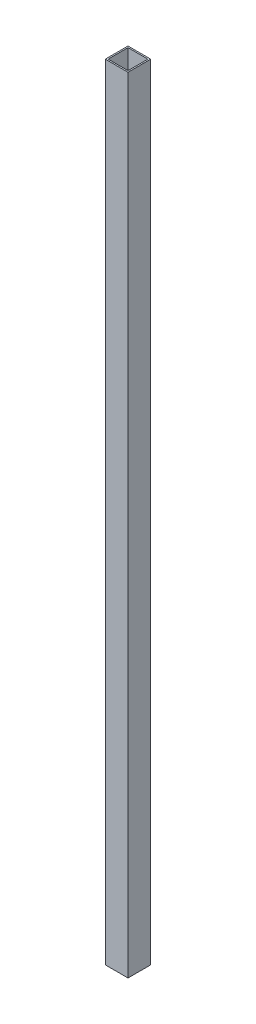
ISO-10303-21;
HEADER;
FILE_DESCRIPTION(('STEP AP214'),'2;1');
FILE_NAME('part.step','',(''),(''),'','','');
FILE_SCHEMA(('AUTOMOTIVE_DESIGN { 1 0 10303 214 1 1 1 1 }'));
ENDSEC;
DATA;
#1=APPLICATION_CONTEXT('core data for automotive mechanical design processes');
#2=APPLICATION_PROTOCOL_DEFINITION('international standard','automotive_design',2000,#1);
#3=PRODUCT_CONTEXT('',#1,'mechanical');
#4=PRODUCT('Part','Part','',(#3));
#5=PRODUCT_RELATED_PRODUCT_CATEGORY('part','',(#4));
#6=PRODUCT_DEFINITION_FORMATION('','',#4);
#7=PRODUCT_DEFINITION_CONTEXT('part definition',#1,'design');
#8=PRODUCT_DEFINITION('design','',#6,#7);
#9=PRODUCT_DEFINITION_SHAPE('','',#8);
#10=(LENGTH_UNIT() NAMED_UNIT(*) SI_UNIT(.MILLI.,.METRE.));
#11=(NAMED_UNIT(*) PLANE_ANGLE_UNIT() SI_UNIT($,.RADIAN.));
#12=(NAMED_UNIT(*) SI_UNIT($,.STERADIAN.) SOLID_ANGLE_UNIT());
#13=UNCERTAINTY_MEASURE_WITH_UNIT(LENGTH_MEASURE(1.E-05),#10,'distance_accuracy_value','');
#14=(GEOMETRIC_REPRESENTATION_CONTEXT(3) GLOBAL_UNCERTAINTY_ASSIGNED_CONTEXT((#13)) GLOBAL_UNIT_ASSIGNED_CONTEXT((#10,
#11,#12)) REPRESENTATION_CONTEXT('',''));
#15=CARTESIAN_POINT('',(0.,0.,0.));
#16=DIRECTION('',(0.,0.,1.));
#17=DIRECTION('',(1.,0.,0.));
#18=AXIS2_PLACEMENT_3D('',#15,#16,#17);
#19=CARTESIAN_POINT('',(-12.7,0.,12.7));
#20=DIRECTION('',(0.,-1.,0.));
#21=DIRECTION('',(0.,0.,-1.));
#22=AXIS2_PLACEMENT_3D('',#19,#20,#21);
#23=PLANE('',#22);
#24=DIRECTION('',(-1.,0.,0.));
#25=VECTOR('',#24,1.);
#26=CARTESIAN_POINT('',(0.,0.,11.1125));
#27=LINE('',#26,#25);
#28=CARTESIAN_POINT('',(11.1125,0.,11.1125));
#29=VERTEX_POINT('',#28);
#30=CARTESIAN_POINT('',(-11.1125,0.,11.1125));
#31=VERTEX_POINT('',#30);
#32=EDGE_CURVE('E108',#29,#31,#27,.T.);
#33=ORIENTED_EDGE('',*,*,#32,.F.);
#34=DIRECTION('',(0.,0.,1.));
#35=VECTOR('',#34,1.);
#36=CARTESIAN_POINT('',(11.1125,0.,0.));
#37=LINE('',#36,#35);
#38=CARTESIAN_POINT('',(11.1125,0.,-11.1125));
#39=VERTEX_POINT('',#38);
#40=EDGE_CURVE('E110',#39,#29,#37,.T.);
#41=ORIENTED_EDGE('',*,*,#40,.F.);
#42=DIRECTION('',(1.,0.,0.));
#43=VECTOR('',#42,1.);
#44=CARTESIAN_POINT('',(0.,0.,-11.1125));
#45=LINE('',#44,#43);
#46=CARTESIAN_POINT('',(-11.1125,0.,-11.1125));
#47=VERTEX_POINT('',#46);
#48=EDGE_CURVE('E114',#47,#39,#45,.T.);
#49=ORIENTED_EDGE('',*,*,#48,.F.);
#50=DIRECTION('',(0.,0.,-1.));
#51=VECTOR('',#50,1.);
#52=CARTESIAN_POINT('',(-11.1125,0.,0.));
#53=LINE('',#52,#51);
#54=EDGE_CURVE('E118',#31,#47,#53,.T.);
#55=ORIENTED_EDGE('',*,*,#54,.F.);
#56=EDGE_LOOP('',(#33,#41,#49,#55));
#57=FACE_BOUND('',#56,.T.);
#58=DIRECTION('',(0.,0.,1.));
#59=VECTOR('',#58,1.);
#60=CARTESIAN_POINT('',(12.7,0.,0.));
#61=LINE('',#60,#59);
#62=CARTESIAN_POINT('',(12.7,0.,-12.7));
#63=VERTEX_POINT('',#62);
#64=CARTESIAN_POINT('',(12.7,0.,12.7));
#65=VERTEX_POINT('',#64);
#66=EDGE_CURVE('E78',#63,#65,#61,.T.);
#67=ORIENTED_EDGE('',*,*,#66,.T.);
#68=DIRECTION('',(-1.,0.,0.));
#69=VECTOR('',#68,1.);
#70=CARTESIAN_POINT('',(0.,0.,12.7));
#71=LINE('',#70,#69);
#72=CARTESIAN_POINT('',(-12.7,0.,12.7));
#73=VERTEX_POINT('',#72);
#74=EDGE_CURVE('E100',#65,#73,#71,.T.);
#75=ORIENTED_EDGE('',*,*,#74,.T.);
#76=DIRECTION('',(0.,0.,-1.));
#77=VECTOR('',#76,1.);
#78=CARTESIAN_POINT('',(-12.7,0.,0.));
#79=LINE('',#78,#77);
#80=CARTESIAN_POINT('',(-12.7,0.,-12.7));
#81=VERTEX_POINT('',#80);
#82=EDGE_CURVE('E82',#73,#81,#79,.T.);
#83=ORIENTED_EDGE('',*,*,#82,.T.);
#84=DIRECTION('',(1.,0.,0.));
#85=VECTOR('',#84,1.);
#86=CARTESIAN_POINT('',(0.,0.,-12.7));
#87=LINE('',#86,#85);
#88=EDGE_CURVE('E20',#81,#63,#87,.T.);
#89=ORIENTED_EDGE('',*,*,#88,.T.);
#90=EDGE_LOOP('',(#67,#75,#83,#89));
#91=FACE_BOUND('',#90,.T.);
#92=ADVANCED_FACE('F16',(#57,#91),#23,.T.);
#93=CARTESIAN_POINT('',(-12.7,0.,-12.7));
#94=DIRECTION('',(0.,0.,1.));
#95=DIRECTION('',(1.,0.,0.));
#96=AXIS2_PLACEMENT_3D('',#93,#94,#95);
#97=PLANE('',#96);
#98=DIRECTION('',(0.,1.,0.));
#99=VECTOR('',#98,1.);
#100=CARTESIAN_POINT('',(-12.7,438.15,-12.7));
#101=LINE('',#100,#99);
#102=CARTESIAN_POINT('',(-12.7,876.3,-12.7));
#103=VERTEX_POINT('',#102);
#104=EDGE_CURVE('E102',#81,#103,#101,.T.);
#105=ORIENTED_EDGE('',*,*,#104,.T.);
#106=DIRECTION('',(1.,0.,0.));
#107=VECTOR('',#106,1.);
#108=CARTESIAN_POINT('',(0.,876.3,-12.7));
#109=LINE('',#108,#107);
#110=CARTESIAN_POINT('',(12.7,876.3,-12.7));
#111=VERTEX_POINT('',#110);
#112=EDGE_CURVE('E97',#103,#111,#109,.T.);
#113=ORIENTED_EDGE('',*,*,#112,.T.);
#114=DIRECTION('',(0.,-1.,0.));
#115=VECTOR('',#114,1.);
#116=CARTESIAN_POINT('',(12.7,438.15,-12.7));
#117=LINE('',#116,#115);
#118=EDGE_CURVE('E87',#111,#63,#117,.T.);
#119=ORIENTED_EDGE('',*,*,#118,.T.);
#120=ORIENTED_EDGE('',*,*,#88,.F.);
#121=EDGE_LOOP('',(#105,#113,#119,#120));
#122=FACE_BOUND('',#121,.T.);
#123=ADVANCED_FACE('F96',(#122),#97,.F.);
#124=CARTESIAN_POINT('',(12.7,0.,-12.7));
#125=DIRECTION('',(-1.,0.,0.));
#126=DIRECTION('',(0.,0.,1.));
#127=AXIS2_PLACEMENT_3D('',#124,#125,#126);
#128=PLANE('',#127);
#129=ORIENTED_EDGE('',*,*,#118,.F.);
#130=DIRECTION('',(0.,0.,1.));
#131=VECTOR('',#130,1.);
#132=CARTESIAN_POINT('',(12.7,876.3,0.));
#133=LINE('',#132,#131);
#134=CARTESIAN_POINT('',(12.7,876.3,12.7));
#135=VERTEX_POINT('',#134);
#136=EDGE_CURVE('E125',#111,#135,#133,.T.);
#137=ORIENTED_EDGE('',*,*,#136,.T.);
#138=DIRECTION('',(0.,-1.,0.));
#139=VECTOR('',#138,1.);
#140=CARTESIAN_POINT('',(12.7,438.15,12.7));
#141=LINE('',#140,#139);
#142=EDGE_CURVE('E93',#135,#65,#141,.T.);
#143=ORIENTED_EDGE('',*,*,#142,.T.);
#144=ORIENTED_EDGE('',*,*,#66,.F.);
#145=EDGE_LOOP('',(#129,#137,#143,#144));
#146=FACE_BOUND('',#145,.T.);
#147=ADVANCED_FACE('F90',(#146),#128,.F.);
#148=CARTESIAN_POINT('',(12.7,0.,12.7));
#149=DIRECTION('',(0.,0.,-1.));
#150=DIRECTION('',(-1.,0.,0.));
#151=AXIS2_PLACEMENT_3D('',#148,#149,#150);
#152=PLANE('',#151);
#153=ORIENTED_EDGE('',*,*,#142,.F.);
#154=DIRECTION('',(-1.,0.,0.));
#155=VECTOR('',#154,1.);
#156=CARTESIAN_POINT('',(0.,876.3,12.7));
#157=LINE('',#156,#155);
#158=CARTESIAN_POINT('',(-12.7,876.3,12.7));
#159=VERTEX_POINT('',#158);
#160=EDGE_CURVE('E127',#135,#159,#157,.T.);
#161=ORIENTED_EDGE('',*,*,#160,.T.);
#162=DIRECTION('',(0.,-1.,0.));
#163=VECTOR('',#162,1.);
#164=CARTESIAN_POINT('',(-12.7,438.15,12.7));
#165=LINE('',#164,#163);
#166=EDGE_CURVE('E104',#159,#73,#165,.T.);
#167=ORIENTED_EDGE('',*,*,#166,.T.);
#168=ORIENTED_EDGE('',*,*,#74,.F.);
#169=EDGE_LOOP('',(#153,#161,#167,#168));
#170=FACE_BOUND('',#169,.T.);
#171=ADVANCED_FACE('F172',(#170),#152,.F.);
#172=CARTESIAN_POINT('',(-12.7,0.,12.7));
#173=DIRECTION('',(1.,0.,0.));
#174=DIRECTION('',(0.,0.,-1.));
#175=AXIS2_PLACEMENT_3D('',#172,#173,#174);
#176=PLANE('',#175);
#177=ORIENTED_EDGE('',*,*,#166,.F.);
#178=DIRECTION('',(0.,0.,-1.));
#179=VECTOR('',#178,1.);
#180=CARTESIAN_POINT('',(-12.7,876.3,0.));
#181=LINE('',#180,#179);
#182=EDGE_CURVE('E130',#159,#103,#181,.T.);
#183=ORIENTED_EDGE('',*,*,#182,.T.);
#184=ORIENTED_EDGE('',*,*,#104,.F.);
#185=ORIENTED_EDGE('',*,*,#82,.F.);
#186=EDGE_LOOP('',(#177,#183,#184,#185));
#187=FACE_BOUND('',#186,.T.);
#188=ADVANCED_FACE('F169',(#187),#176,.F.);
#189=CARTESIAN_POINT('',(11.1125,0.,11.1125));
#190=DIRECTION('',(0.,0.,-1.));
#191=DIRECTION('',(-1.,0.,0.));
#192=AXIS2_PLACEMENT_3D('',#189,#190,#191);
#193=PLANE('',#192);
#194=DIRECTION('',(1.,0.,0.));
#195=VECTOR('',#194,1.);
#196=CARTESIAN_POINT('',(0.,876.3,11.1125));
#197=LINE('',#196,#195);
#198=CARTESIAN_POINT('',(-11.1125,876.3,11.1125));
#199=VERTEX_POINT('',#198);
#200=CARTESIAN_POINT('',(11.1125,876.3,11.1125));
#201=VERTEX_POINT('',#200);
#202=EDGE_CURVE('E133',#199,#201,#197,.T.);
#203=ORIENTED_EDGE('',*,*,#202,.T.);
#204=DIRECTION('',(0.,1.,0.));
#205=VECTOR('',#204,1.);
#206=CARTESIAN_POINT('',(11.1125,438.15,11.1125));
#207=LINE('',#206,#205);
#208=EDGE_CURVE('E112',#29,#201,#207,.T.);
#209=ORIENTED_EDGE('',*,*,#208,.F.);
#210=ORIENTED_EDGE('',*,*,#32,.T.);
#211=DIRECTION('',(0.,-1.,0.));
#212=VECTOR('',#211,1.);
#213=CARTESIAN_POINT('',(-11.1125,438.15,11.1125));
#214=LINE('',#213,#212);
#215=EDGE_CURVE('E121',#199,#31,#214,.T.);
#216=ORIENTED_EDGE('',*,*,#215,.F.);
#217=EDGE_LOOP('',(#203,#209,#210,#216));
#218=FACE_BOUND('',#217,.T.);
#219=ADVANCED_FACE('F153',(#218),#193,.T.);
#220=CARTESIAN_POINT('',(11.1125,0.,-11.1125));
#221=DIRECTION('',(-1.,0.,0.));
#222=DIRECTION('',(0.,0.,1.));
#223=AXIS2_PLACEMENT_3D('',#220,#221,#222);
#224=PLANE('',#223);
#225=DIRECTION('',(0.,0.,-1.));
#226=VECTOR('',#225,1.);
#227=CARTESIAN_POINT('',(11.1125,876.3,0.));
#228=LINE('',#227,#226);
#229=CARTESIAN_POINT('',(11.1125,876.3,-11.1125));
#230=VERTEX_POINT('',#229);
#231=EDGE_CURVE('E136',#201,#230,#228,.T.);
#232=ORIENTED_EDGE('',*,*,#231,.T.);
#233=DIRECTION('',(0.,1.,0.));
#234=VECTOR('',#233,1.);
#235=CARTESIAN_POINT('',(11.1125,438.15,-11.1125));
#236=LINE('',#235,#234);
#237=EDGE_CURVE('E116',#39,#230,#236,.T.);
#238=ORIENTED_EDGE('',*,*,#237,.F.);
#239=ORIENTED_EDGE('',*,*,#40,.T.);
#240=ORIENTED_EDGE('',*,*,#208,.T.);
#241=EDGE_LOOP('',(#232,#238,#239,#240));
#242=FACE_BOUND('',#241,.T.);
#243=ADVANCED_FACE('F148',(#242),#224,.T.);
#244=CARTESIAN_POINT('',(-11.1125,0.,-11.1125));
#245=DIRECTION('',(0.,0.,1.));
#246=DIRECTION('',(1.,0.,0.));
#247=AXIS2_PLACEMENT_3D('',#244,#245,#246);
#248=PLANE('',#247);
#249=DIRECTION('',(-1.,0.,0.));
#250=VECTOR('',#249,1.);
#251=CARTESIAN_POINT('',(0.,876.3,-11.1125));
#252=LINE('',#251,#250);
#253=CARTESIAN_POINT('',(-11.1125,876.3,-11.1125));
#254=VERTEX_POINT('',#253);
#255=EDGE_CURVE('E26',#230,#254,#252,.T.);
#256=ORIENTED_EDGE('',*,*,#255,.T.);
#257=DIRECTION('',(0.,1.,0.));
#258=VECTOR('',#257,1.);
#259=CARTESIAN_POINT('',(-11.1125,438.15,-11.1125));
#260=LINE('',#259,#258);
#261=EDGE_CURVE('E34',#47,#254,#260,.T.);
#262=ORIENTED_EDGE('',*,*,#261,.F.);
#263=ORIENTED_EDGE('',*,*,#48,.T.);
#264=ORIENTED_EDGE('',*,*,#237,.T.);
#265=EDGE_LOOP('',(#256,#262,#263,#264));
#266=FACE_BOUND('',#265,.T.);
#267=ADVANCED_FACE('F142',(#266),#248,.T.);
#268=CARTESIAN_POINT('',(-11.1125,0.,11.1125));
#269=DIRECTION('',(1.,0.,0.));
#270=DIRECTION('',(0.,0.,-1.));
#271=AXIS2_PLACEMENT_3D('',#268,#269,#270);
#272=PLANE('',#271);
#273=DIRECTION('',(0.,0.,1.));
#274=VECTOR('',#273,1.);
#275=CARTESIAN_POINT('',(-11.1125,876.3,0.));
#276=LINE('',#275,#274);
#277=EDGE_CURVE('E11',#254,#199,#276,.T.);
#278=ORIENTED_EDGE('',*,*,#277,.T.);
#279=ORIENTED_EDGE('',*,*,#215,.T.);
#280=ORIENTED_EDGE('',*,*,#54,.T.);
#281=ORIENTED_EDGE('',*,*,#261,.T.);
#282=EDGE_LOOP('',(#278,#279,#280,#281));
#283=FACE_BOUND('',#282,.T.);
#284=ADVANCED_FACE('F156',(#283),#272,.T.);
#285=CARTESIAN_POINT('',(-12.7,876.3,12.7));
#286=DIRECTION('',(0.,-1.,0.));
#287=DIRECTION('',(0.,0.,-1.));
#288=AXIS2_PLACEMENT_3D('',#285,#286,#287);
#289=PLANE('',#288);
#290=ORIENTED_EDGE('',*,*,#255,.F.);
#291=ORIENTED_EDGE('',*,*,#231,.F.);
#292=ORIENTED_EDGE('',*,*,#202,.F.);
#293=ORIENTED_EDGE('',*,*,#277,.F.);
#294=EDGE_LOOP('',(#290,#291,#292,#293));
#295=FACE_BOUND('',#294,.T.);
#296=ORIENTED_EDGE('',*,*,#160,.F.);
#297=ORIENTED_EDGE('',*,*,#136,.F.);
#298=ORIENTED_EDGE('',*,*,#112,.F.);
#299=ORIENTED_EDGE('',*,*,#182,.F.);
#300=EDGE_LOOP('',(#296,#297,#298,#299));
#301=FACE_BOUND('',#300,.T.);
#302=ADVANCED_FACE('F18',(#295,#301),#289,.F.);
#303=CLOSED_SHELL('',(#92,#123,#147,#171,#188,#219,#243,#267,#284,#302));
#304=MANIFOLD_SOLID_BREP('B1',#303);
#305=ADVANCED_BREP_SHAPE_REPRESENTATION('',(#18,#304),#14);
#306=SHAPE_DEFINITION_REPRESENTATION(#9,#305);
ENDSEC;
END-ISO-10303-21;
